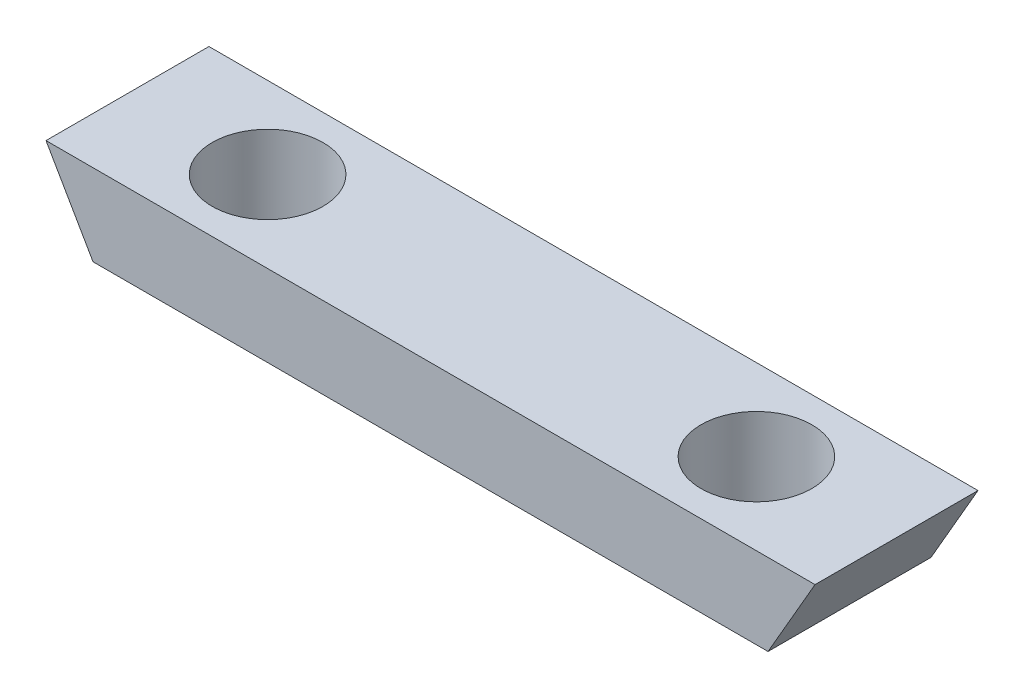
ISO-10303-21;
HEADER;
FILE_DESCRIPTION(('STEP AP214'),'2;1');
FILE_NAME('part.step','',(''),(''),'','','');
FILE_SCHEMA(('AUTOMOTIVE_DESIGN { 1 0 10303 214 1 1 1 1 }'));
ENDSEC;
DATA;
#1=APPLICATION_CONTEXT('core data for automotive mechanical design processes');
#2=APPLICATION_PROTOCOL_DEFINITION('international standard','automotive_design',2000,#1);
#3=PRODUCT_CONTEXT('',#1,'mechanical');
#4=PRODUCT('Part','Part','',(#3));
#5=PRODUCT_RELATED_PRODUCT_CATEGORY('part','',(#4));
#6=PRODUCT_DEFINITION_FORMATION('','',#4);
#7=PRODUCT_DEFINITION_CONTEXT('part definition',#1,'design');
#8=PRODUCT_DEFINITION('design','',#6,#7);
#9=PRODUCT_DEFINITION_SHAPE('','',#8);
#10=(LENGTH_UNIT() NAMED_UNIT(*) SI_UNIT(.MILLI.,.METRE.));
#11=(NAMED_UNIT(*) PLANE_ANGLE_UNIT() SI_UNIT($,.RADIAN.));
#12=(NAMED_UNIT(*) SI_UNIT($,.STERADIAN.) SOLID_ANGLE_UNIT());
#13=UNCERTAINTY_MEASURE_WITH_UNIT(LENGTH_MEASURE(1.E-05),#10,'distance_accuracy_value','');
#14=(GEOMETRIC_REPRESENTATION_CONTEXT(3) GLOBAL_UNCERTAINTY_ASSIGNED_CONTEXT((#13)) GLOBAL_UNIT_ASSIGNED_CONTEXT((#10,
#11,#12)) REPRESENTATION_CONTEXT('',''));
#15=CARTESIAN_POINT('',(0.,0.,0.));
#16=DIRECTION('',(0.,0.,1.));
#17=DIRECTION('',(1.,0.,0.));
#18=AXIS2_PLACEMENT_3D('',#15,#16,#17);
#19=CARTESIAN_POINT('',(-14.986,0.,6.35));
#20=DIRECTION('',(0.86602540378444,0.499999999999998,0.));
#21=DIRECTION('',(-0.499999999999998,0.86602540378444,0.));
#22=AXIS2_PLACEMENT_3D('',#19,#20,#21);
#23=PLANE('',#22);
#24=DIRECTION('',(0.499999999999998,-0.86602540378444,0.));
#25=VECTOR('',#24,1.);
#26=CARTESIAN_POINT('',(-14.986,0.,0.));
#27=LINE('',#26,#25);
#28=CARTESIAN_POINT('',(-14.986,0.,0.));
#29=VERTEX_POINT('',#28);
#30=CARTESIAN_POINT('',(-13.1529128953229,-3.175,0.));
#31=VERTEX_POINT('',#30);
#32=EDGE_CURVE('E110',#29,#31,#27,.T.);
#33=ORIENTED_EDGE('',*,*,#32,.T.);
#34=DIRECTION('',(0.,0.,-1.));
#35=VECTOR('',#34,1.);
#36=CARTESIAN_POINT('',(-13.1529128953229,-3.175,6.35));
#37=LINE('',#36,#35);
#38=CARTESIAN_POINT('',(-13.1529128953229,-3.175,6.35));
#39=VERTEX_POINT('',#38);
#40=EDGE_CURVE('E11',#39,#31,#37,.T.);
#41=ORIENTED_EDGE('',*,*,#40,.F.);
#42=DIRECTION('',(0.499999999999998,-0.86602540378444,0.));
#43=VECTOR('',#42,1.);
#44=CARTESIAN_POINT('',(-14.986,0.,6.35));
#45=LINE('',#44,#43);
#46=CARTESIAN_POINT('',(-14.986,0.,6.35));
#47=VERTEX_POINT('',#46);
#48=EDGE_CURVE('E93',#47,#39,#45,.T.);
#49=ORIENTED_EDGE('',*,*,#48,.F.);
#50=DIRECTION('',(0.,0.,-1.));
#51=VECTOR('',#50,1.);
#52=CARTESIAN_POINT('',(-14.986,0.,6.35));
#53=LINE('',#52,#51);
#54=EDGE_CURVE('E106',#47,#29,#53,.T.);
#55=ORIENTED_EDGE('',*,*,#54,.T.);
#56=EDGE_LOOP('',(#33,#41,#49,#55));
#57=FACE_BOUND('',#56,.T.);
#58=ADVANCED_FACE('F39',(#57),#23,.F.);
#59=CARTESIAN_POINT('',(-13.1529128953229,-3.175,6.35));
#60=DIRECTION('',(0.,1.,0.));
#61=DIRECTION('',(0.,0.,1.));
#62=AXIS2_PLACEMENT_3D('',#59,#60,#61);
#63=PLANE('',#62);
#64=CARTESIAN_POINT('',(-9.52500000000002,-3.175,3.175));
#65=DIRECTION('',(0.,-1.,0.));
#66=DIRECTION('',(0.,0.,-1.));
#67=AXIS2_PLACEMENT_3D('',#64,#65,#66);
#68=CIRCLE('',#67,2.159);
#69=CARTESIAN_POINT('',(-9.52500000000002,-3.175,1.016));
#70=VERTEX_POINT('',#69);
#71=EDGE_CURVE('E126',#70,#70,#68,.T.);
#72=ORIENTED_EDGE('',*,*,#71,.F.);
#73=EDGE_LOOP('',(#72));
#74=FACE_BOUND('',#73,.T.);
#75=CARTESIAN_POINT('',(9.52499999999998,-3.175,3.175));
#76=DIRECTION('',(0.,-1.,0.));
#77=DIRECTION('',(0.,0.,-1.));
#78=AXIS2_PLACEMENT_3D('',#75,#76,#77);
#79=CIRCLE('',#78,2.159);
#80=CARTESIAN_POINT('',(9.52499999999998,-3.175,1.016));
#81=VERTEX_POINT('',#80);
#82=EDGE_CURVE('E133',#81,#81,#79,.T.);
#83=ORIENTED_EDGE('',*,*,#82,.F.);
#84=EDGE_LOOP('',(#83));
#85=FACE_BOUND('',#84,.T.);
#86=DIRECTION('',(1.,0.,0.));
#87=VECTOR('',#86,1.);
#88=CARTESIAN_POINT('',(-13.1529128953229,-3.175,0.));
#89=LINE('',#88,#87);
#90=CARTESIAN_POINT('',(13.1529128953229,-3.175,0.));
#91=VERTEX_POINT('',#90);
#92=EDGE_CURVE('E98',#31,#91,#89,.T.);
#93=ORIENTED_EDGE('',*,*,#92,.T.);
#94=DIRECTION('',(0.,0.,-1.));
#95=VECTOR('',#94,1.);
#96=CARTESIAN_POINT('',(13.1529128953229,-3.175,6.35));
#97=LINE('',#96,#95);
#98=CARTESIAN_POINT('',(13.1529128953229,-3.175,6.35));
#99=VERTEX_POINT('',#98);
#100=EDGE_CURVE('E49',#99,#91,#97,.T.);
#101=ORIENTED_EDGE('',*,*,#100,.F.);
#102=DIRECTION('',(1.,0.,0.));
#103=VECTOR('',#102,1.);
#104=CARTESIAN_POINT('',(-13.1529128953229,-3.175,6.35));
#105=LINE('',#104,#103);
#106=EDGE_CURVE('E88',#39,#99,#105,.T.);
#107=ORIENTED_EDGE('',*,*,#106,.F.);
#108=ORIENTED_EDGE('',*,*,#40,.T.);
#109=EDGE_LOOP('',(#93,#101,#107,#108));
#110=FACE_BOUND('',#109,.T.);
#111=ADVANCED_FACE('F97',(#74,#85,#110),#63,.F.);
#112=CARTESIAN_POINT('',(14.986,0.,6.35));
#113=DIRECTION('',(-0.866025403784436,0.500000000000004,0.));
#114=DIRECTION('',(-0.500000000000004,-0.866025403784436,0.));
#115=AXIS2_PLACEMENT_3D('',#112,#113,#114);
#116=PLANE('',#115);
#117=DIRECTION('',(0.500000000000004,0.866025403784436,0.));
#118=VECTOR('',#117,1.);
#119=CARTESIAN_POINT('',(14.986,0.,0.));
#120=LINE('',#119,#118);
#121=CARTESIAN_POINT('',(14.986,0.,0.));
#122=VERTEX_POINT('',#121);
#123=EDGE_CURVE('E75',#91,#122,#120,.T.);
#124=ORIENTED_EDGE('',*,*,#123,.T.);
#125=DIRECTION('',(0.,0.,-1.));
#126=VECTOR('',#125,1.);
#127=CARTESIAN_POINT('',(14.986,0.,6.35));
#128=LINE('',#127,#126);
#129=CARTESIAN_POINT('',(14.986,0.,6.35));
#130=VERTEX_POINT('',#129);
#131=EDGE_CURVE('E100',#130,#122,#128,.T.);
#132=ORIENTED_EDGE('',*,*,#131,.F.);
#133=DIRECTION('',(0.500000000000004,0.866025403784436,0.));
#134=VECTOR('',#133,1.);
#135=CARTESIAN_POINT('',(14.986,0.,6.35));
#136=LINE('',#135,#134);
#137=EDGE_CURVE('E91',#99,#130,#136,.T.);
#138=ORIENTED_EDGE('',*,*,#137,.F.);
#139=ORIENTED_EDGE('',*,*,#100,.T.);
#140=EDGE_LOOP('',(#124,#132,#138,#139));
#141=FACE_BOUND('',#140,.T.);
#142=ADVANCED_FACE('F102',(#141),#116,.F.);
#143=CARTESIAN_POINT('',(-14.986,0.,6.35));
#144=DIRECTION('',(0.,-1.,0.));
#145=DIRECTION('',(0.,0.,-1.));
#146=AXIS2_PLACEMENT_3D('',#143,#144,#145);
#147=PLANE('',#146);
#148=CARTESIAN_POINT('',(-9.52500000000002,0.,3.175));
#149=DIRECTION('',(0.,-1.,0.));
#150=DIRECTION('',(0.,0.,-1.));
#151=AXIS2_PLACEMENT_3D('',#148,#149,#150);
#152=CIRCLE('',#151,2.159);
#153=CARTESIAN_POINT('',(-9.52500000000002,0.,1.016));
#154=VERTEX_POINT('',#153);
#155=EDGE_CURVE('E42',#154,#154,#152,.T.);
#156=ORIENTED_EDGE('',*,*,#155,.T.);
#157=EDGE_LOOP('',(#156));
#158=FACE_BOUND('',#157,.T.);
#159=CARTESIAN_POINT('',(9.52499999999998,0.,3.175));
#160=DIRECTION('',(0.,-1.,0.));
#161=DIRECTION('',(0.,0.,-1.));
#162=AXIS2_PLACEMENT_3D('',#159,#160,#161);
#163=CIRCLE('',#162,2.159);
#164=CARTESIAN_POINT('',(9.52499999999998,0.,1.016));
#165=VERTEX_POINT('',#164);
#166=EDGE_CURVE('E123',#165,#165,#163,.T.);
#167=ORIENTED_EDGE('',*,*,#166,.T.);
#168=EDGE_LOOP('',(#167));
#169=FACE_BOUND('',#168,.T.);
#170=DIRECTION('',(-1.,0.,0.));
#171=VECTOR('',#170,1.);
#172=CARTESIAN_POINT('',(-14.986,0.,0.));
#173=LINE('',#172,#171);
#174=EDGE_CURVE('E81',#122,#29,#173,.T.);
#175=ORIENTED_EDGE('',*,*,#174,.T.);
#176=ORIENTED_EDGE('',*,*,#54,.F.);
#177=DIRECTION('',(-1.,0.,0.));
#178=VECTOR('',#177,1.);
#179=CARTESIAN_POINT('',(-14.986,0.,6.35));
#180=LINE('',#179,#178);
#181=EDGE_CURVE('E58',#130,#47,#180,.T.);
#182=ORIENTED_EDGE('',*,*,#181,.F.);
#183=ORIENTED_EDGE('',*,*,#131,.T.);
#184=EDGE_LOOP('',(#175,#176,#182,#183));
#185=FACE_BOUND('',#184,.T.);
#186=ADVANCED_FACE('F152',(#158,#169,#185),#147,.F.);
#187=CARTESIAN_POINT('',(0.,0.,6.35));
#188=DIRECTION('',(0.,0.,1.));
#189=DIRECTION('',(1.,0.,0.));
#190=AXIS2_PLACEMENT_3D('',#187,#188,#189);
#191=PLANE('',#190);
#192=ORIENTED_EDGE('',*,*,#48,.T.);
#193=ORIENTED_EDGE('',*,*,#106,.T.);
#194=ORIENTED_EDGE('',*,*,#137,.T.);
#195=ORIENTED_EDGE('',*,*,#181,.T.);
#196=EDGE_LOOP('',(#192,#193,#194,#195));
#197=FACE_BOUND('',#196,.T.);
#198=ADVANCED_FACE('F89',(#197),#191,.T.);
#199=CARTESIAN_POINT('',(0.,0.,0.));
#200=DIRECTION('',(0.,0.,1.));
#201=DIRECTION('',(1.,0.,0.));
#202=AXIS2_PLACEMENT_3D('',#199,#200,#201);
#203=PLANE('',#202);
#204=ORIENTED_EDGE('',*,*,#32,.F.);
#205=ORIENTED_EDGE('',*,*,#174,.F.);
#206=ORIENTED_EDGE('',*,*,#123,.F.);
#207=ORIENTED_EDGE('',*,*,#92,.F.);
#208=EDGE_LOOP('',(#204,#205,#206,#207));
#209=FACE_BOUND('',#208,.T.);
#210=ADVANCED_FACE('F159',(#209),#203,.F.);
#211=CARTESIAN_POINT('',(9.52499999999998,1.905,3.175));
#212=DIRECTION('',(0.,-1.,0.));
#213=DIRECTION('',(0.,0.,-1.));
#214=AXIS2_PLACEMENT_3D('',#211,#212,#213);
#215=CYLINDRICAL_SURFACE('',#214,2.159);
#216=ORIENTED_EDGE('',*,*,#82,.T.);
#217=EDGE_LOOP('',(#216));
#218=FACE_BOUND('',#217,.T.);
#219=ORIENTED_EDGE('',*,*,#166,.F.);
#220=EDGE_LOOP('',(#219));
#221=FACE_BOUND('',#220,.T.);
#222=ADVANCED_FACE('F143',(#218,#221),#215,.F.);
#223=CARTESIAN_POINT('',(-9.52500000000002,1.905,3.175));
#224=DIRECTION('',(0.,-1.,0.));
#225=DIRECTION('',(0.,0.,-1.));
#226=AXIS2_PLACEMENT_3D('',#223,#224,#225);
#227=CYLINDRICAL_SURFACE('',#226,2.159);
#228=ORIENTED_EDGE('',*,*,#71,.T.);
#229=EDGE_LOOP('',(#228));
#230=FACE_BOUND('',#229,.T.);
#231=ORIENTED_EDGE('',*,*,#155,.F.);
#232=EDGE_LOOP('',(#231));
#233=FACE_BOUND('',#232,.T.);
#234=ADVANCED_FACE('F167',(#230,#233),#227,.F.);
#235=CLOSED_SHELL('',(#58,#111,#142,#186,#198,#210,#222,#234));
#236=MANIFOLD_SOLID_BREP('B2',#235);
#237=ADVANCED_BREP_SHAPE_REPRESENTATION('',(#18,#236),#14);
#238=SHAPE_DEFINITION_REPRESENTATION(#9,#237);
ENDSEC;
END-ISO-10303-21;
